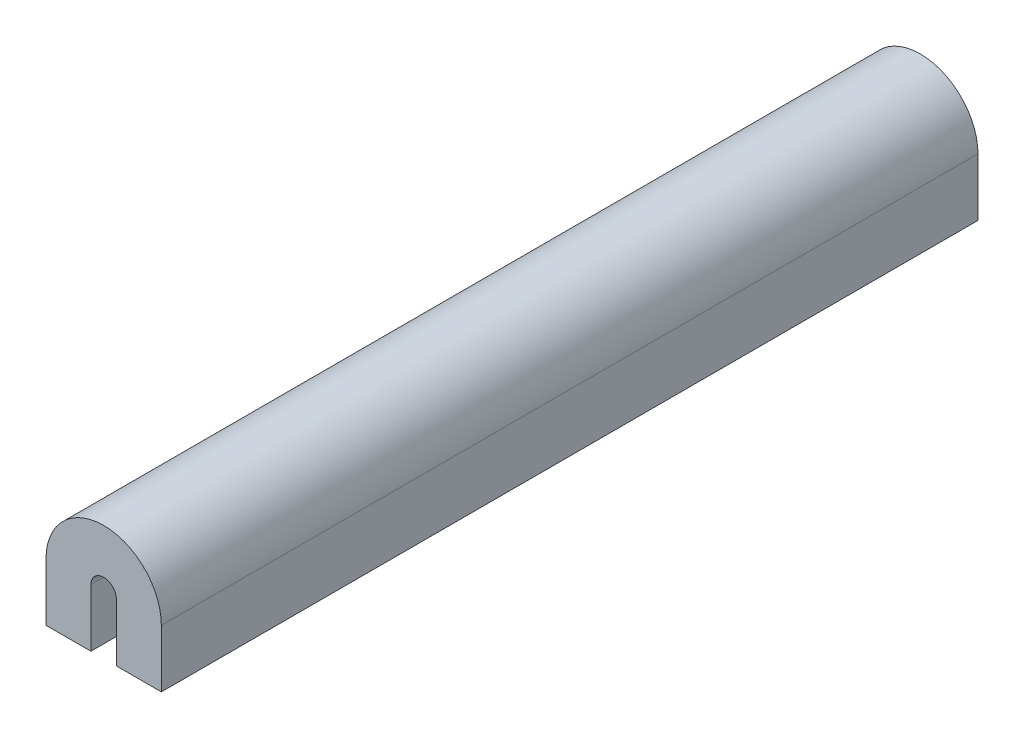
ISO-10303-21;
HEADER;
FILE_DESCRIPTION(('STEP AP214'),'2;1');
FILE_NAME('part.step','',(''),(''),'','','');
FILE_SCHEMA(('AUTOMOTIVE_DESIGN { 1 0 10303 214 1 1 1 1 }'));
ENDSEC;
DATA;
#1=APPLICATION_CONTEXT('core data for automotive mechanical design processes');
#2=APPLICATION_PROTOCOL_DEFINITION('international standard','automotive_design',2000,#1);
#3=PRODUCT_CONTEXT('',#1,'mechanical');
#4=PRODUCT('Part','Part','',(#3));
#5=PRODUCT_RELATED_PRODUCT_CATEGORY('part','',(#4));
#6=PRODUCT_DEFINITION_FORMATION('','',#4);
#7=PRODUCT_DEFINITION_CONTEXT('part definition',#1,'design');
#8=PRODUCT_DEFINITION('design','',#6,#7);
#9=PRODUCT_DEFINITION_SHAPE('','',#8);
#10=(LENGTH_UNIT() NAMED_UNIT(*) SI_UNIT(.MILLI.,.METRE.));
#11=(NAMED_UNIT(*) PLANE_ANGLE_UNIT() SI_UNIT($,.RADIAN.));
#12=(NAMED_UNIT(*) SI_UNIT($,.STERADIAN.) SOLID_ANGLE_UNIT());
#13=UNCERTAINTY_MEASURE_WITH_UNIT(LENGTH_MEASURE(1.E-05),#10,'distance_accuracy_value','');
#14=(GEOMETRIC_REPRESENTATION_CONTEXT(3) GLOBAL_UNCERTAINTY_ASSIGNED_CONTEXT((#13)) GLOBAL_UNIT_ASSIGNED_CONTEXT((#10,
#11,#12)) REPRESENTATION_CONTEXT('',''));
#15=CARTESIAN_POINT('',(0.,0.,0.));
#16=DIRECTION('',(0.,0.,1.));
#17=DIRECTION('',(1.,0.,0.));
#18=AXIS2_PLACEMENT_3D('',#15,#16,#17);
#19=CARTESIAN_POINT('',(0.,0.,101.6));
#20=DIRECTION('',(0.,0.,-1.));
#21=DIRECTION('',(-1.,0.,0.));
#22=AXIS2_PLACEMENT_3D('',#19,#20,#21);
#23=CYLINDRICAL_SURFACE('',#22,1.5875);
#24=CARTESIAN_POINT('',(0.,0.,0.));
#25=DIRECTION('',(0.,0.,-1.));
#26=DIRECTION('',(1.,0.,0.));
#27=AXIS2_PLACEMENT_3D('',#24,#25,#26);
#28=CIRCLE('',#27,1.5875);
#29=CARTESIAN_POINT('',(-1.5875,0.,0.));
#30=VERTEX_POINT('',#29);
#31=CARTESIAN_POINT('',(1.5875,0.,0.));
#32=VERTEX_POINT('',#31);
#33=EDGE_CURVE('E140',#30,#32,#28,.T.);
#34=ORIENTED_EDGE('',*,*,#33,.T.);
#35=DIRECTION('',(0.,0.,-1.));
#36=VECTOR('',#35,1.);
#37=CARTESIAN_POINT('',(1.5875,0.,101.6));
#38=LINE('',#37,#36);
#39=CARTESIAN_POINT('',(1.5875,0.,101.6));
#40=VERTEX_POINT('',#39);
#41=EDGE_CURVE('E11',#40,#32,#38,.T.);
#42=ORIENTED_EDGE('',*,*,#41,.F.);
#43=CARTESIAN_POINT('',(0.,0.,101.6));
#44=DIRECTION('',(0.,0.,-1.));
#45=DIRECTION('',(1.,0.,0.));
#46=AXIS2_PLACEMENT_3D('',#43,#44,#45);
#47=CIRCLE('',#46,1.5875);
#48=CARTESIAN_POINT('',(-1.5875,0.,101.6));
#49=VERTEX_POINT('',#48);
#50=EDGE_CURVE('E162',#49,#40,#47,.T.);
#51=ORIENTED_EDGE('',*,*,#50,.F.);
#52=DIRECTION('',(0.,0.,-1.));
#53=VECTOR('',#52,1.);
#54=CARTESIAN_POINT('',(-1.5875,0.,101.6));
#55=LINE('',#54,#53);
#56=EDGE_CURVE('E136',#49,#30,#55,.T.);
#57=ORIENTED_EDGE('',*,*,#56,.T.);
#58=EDGE_LOOP('',(#34,#42,#51,#57));
#59=FACE_BOUND('',#58,.T.);
#60=ADVANCED_FACE('F39',(#59),#23,.F.);
#61=CARTESIAN_POINT('',(1.5875,0.,101.6));
#62=DIRECTION('',(1.,0.,0.));
#63=DIRECTION('',(0.,0.,-1.));
#64=AXIS2_PLACEMENT_3D('',#61,#62,#63);
#65=PLANE('',#64);
#66=DIRECTION('',(0.,-1.,0.));
#67=VECTOR('',#66,1.);
#68=CARTESIAN_POINT('',(1.5875,0.,0.));
#69=LINE('',#68,#67);
#70=CARTESIAN_POINT('',(1.5875,-7.1755,0.));
#71=VERTEX_POINT('',#70);
#72=EDGE_CURVE('E144',#32,#71,#69,.T.);
#73=ORIENTED_EDGE('',*,*,#72,.T.);
#74=DIRECTION('',(0.,0.,-1.));
#75=VECTOR('',#74,1.);
#76=CARTESIAN_POINT('',(1.5875,-7.1755,101.6));
#77=LINE('',#76,#75);
#78=CARTESIAN_POINT('',(1.5875,-7.1755,101.6));
#79=VERTEX_POINT('',#78);
#80=EDGE_CURVE('E48',#79,#71,#77,.T.);
#81=ORIENTED_EDGE('',*,*,#80,.F.);
#82=DIRECTION('',(0.,-1.,0.));
#83=VECTOR('',#82,1.);
#84=CARTESIAN_POINT('',(1.5875,0.,101.6));
#85=LINE('',#84,#83);
#86=EDGE_CURVE('E99',#40,#79,#85,.T.);
#87=ORIENTED_EDGE('',*,*,#86,.F.);
#88=ORIENTED_EDGE('',*,*,#41,.T.);
#89=EDGE_LOOP('',(#73,#81,#87,#88));
#90=FACE_BOUND('',#89,.T.);
#91=ADVANCED_FACE('F208',(#90),#65,.F.);
#92=CARTESIAN_POINT('',(7.1755,-7.1755,101.6));
#93=DIRECTION('',(0.,1.,0.));
#94=DIRECTION('',(-1.,0.,0.));
#95=AXIS2_PLACEMENT_3D('',#92,#93,#94);
#96=PLANE('',#95);
#97=DIRECTION('',(1.,0.,0.));
#98=VECTOR('',#97,1.);
#99=CARTESIAN_POINT('',(7.1755,-7.1755,0.));
#100=LINE('',#99,#98);
#101=CARTESIAN_POINT('',(7.1755,-7.1755,0.));
#102=VERTEX_POINT('',#101);
#103=EDGE_CURVE('E147',#71,#102,#100,.T.);
#104=ORIENTED_EDGE('',*,*,#103,.T.);
#105=DIRECTION('',(0.,0.,-1.));
#106=VECTOR('',#105,1.);
#107=CARTESIAN_POINT('',(7.1755,-7.1755,101.6));
#108=LINE('',#107,#106);
#109=CARTESIAN_POINT('',(7.1755,-7.1755,101.6));
#110=VERTEX_POINT('',#109);
#111=EDGE_CURVE('E173',#110,#102,#108,.T.);
#112=ORIENTED_EDGE('',*,*,#111,.F.);
#113=DIRECTION('',(1.,0.,0.));
#114=VECTOR('',#113,1.);
#115=CARTESIAN_POINT('',(7.1755,-7.1755,101.6));
#116=LINE('',#115,#114);
#117=EDGE_CURVE('E183',#79,#110,#116,.T.);
#118=ORIENTED_EDGE('',*,*,#117,.F.);
#119=ORIENTED_EDGE('',*,*,#80,.T.);
#120=EDGE_LOOP('',(#104,#112,#118,#119));
#121=FACE_BOUND('',#120,.T.);
#122=ADVANCED_FACE('F181',(#121),#96,.F.);
#123=CARTESIAN_POINT('',(7.1755,0.,101.6));
#124=DIRECTION('',(-1.,0.,0.));
#125=DIRECTION('',(0.,-1.,0.));
#126=AXIS2_PLACEMENT_3D('',#123,#124,#125);
#127=PLANE('',#126);
#128=DIRECTION('',(0.,1.,0.));
#129=VECTOR('',#128,1.);
#130=CARTESIAN_POINT('',(7.1755,0.,0.));
#131=LINE('',#130,#129);
#132=CARTESIAN_POINT('',(7.1755,0.,0.));
#133=VERTEX_POINT('',#132);
#134=EDGE_CURVE('E150',#102,#133,#131,.T.);
#135=ORIENTED_EDGE('',*,*,#134,.T.);
#136=DIRECTION('',(0.,0.,-1.));
#137=VECTOR('',#136,1.);
#138=CARTESIAN_POINT('',(7.1755,0.,101.6));
#139=LINE('',#138,#137);
#140=CARTESIAN_POINT('',(7.1755,0.,101.6));
#141=VERTEX_POINT('',#140);
#142=EDGE_CURVE('E169',#141,#133,#139,.T.);
#143=ORIENTED_EDGE('',*,*,#142,.F.);
#144=DIRECTION('',(0.,1.,0.));
#145=VECTOR('',#144,1.);
#146=CARTESIAN_POINT('',(7.1755,0.,101.6));
#147=LINE('',#146,#145);
#148=EDGE_CURVE('E196',#110,#141,#147,.T.);
#149=ORIENTED_EDGE('',*,*,#148,.F.);
#150=ORIENTED_EDGE('',*,*,#111,.T.);
#151=EDGE_LOOP('',(#135,#143,#149,#150));
#152=FACE_BOUND('',#151,.T.);
#153=ADVANCED_FACE('F191',(#152),#127,.F.);
#154=CARTESIAN_POINT('',(0.,0.,101.6));
#155=DIRECTION('',(0.,0.,-1.));
#156=DIRECTION('',(-1.,0.,0.));
#157=AXIS2_PLACEMENT_3D('',#154,#155,#156);
#158=CYLINDRICAL_SURFACE('',#157,7.1755);
#159=CARTESIAN_POINT('',(0.,0.,0.));
#160=DIRECTION('',(0.,0.,1.));
#161=DIRECTION('',(1.,0.,0.));
#162=AXIS2_PLACEMENT_3D('',#159,#160,#161);
#163=CIRCLE('',#162,7.1755);
#164=CARTESIAN_POINT('',(-7.1755,0.,0.));
#165=VERTEX_POINT('',#164);
#166=EDGE_CURVE('E153',#133,#165,#163,.T.);
#167=ORIENTED_EDGE('',*,*,#166,.T.);
#168=DIRECTION('',(0.,0.,-1.));
#169=VECTOR('',#168,1.);
#170=CARTESIAN_POINT('',(-7.1755,0.,101.6));
#171=LINE('',#170,#169);
#172=CARTESIAN_POINT('',(-7.1755,0.,101.6));
#173=VERTEX_POINT('',#172);
#174=EDGE_CURVE('E129',#173,#165,#171,.T.);
#175=ORIENTED_EDGE('',*,*,#174,.F.);
#176=CARTESIAN_POINT('',(0.,0.,101.6));
#177=DIRECTION('',(0.,0.,1.));
#178=DIRECTION('',(1.,0.,0.));
#179=AXIS2_PLACEMENT_3D('',#176,#177,#178);
#180=CIRCLE('',#179,7.1755);
#181=EDGE_CURVE('E118',#141,#173,#180,.T.);
#182=ORIENTED_EDGE('',*,*,#181,.F.);
#183=ORIENTED_EDGE('',*,*,#142,.T.);
#184=EDGE_LOOP('',(#167,#175,#182,#183));
#185=FACE_BOUND('',#184,.T.);
#186=ADVANCED_FACE('F194',(#185),#158,.T.);
#187=CARTESIAN_POINT('',(-7.1755,0.,101.6));
#188=DIRECTION('',(1.,0.,0.));
#189=DIRECTION('',(0.,1.,0.));
#190=AXIS2_PLACEMENT_3D('',#187,#188,#189);
#191=PLANE('',#190);
#192=DIRECTION('',(0.,-1.,0.));
#193=VECTOR('',#192,1.);
#194=CARTESIAN_POINT('',(-7.1755,0.,0.));
#195=LINE('',#194,#193);
#196=CARTESIAN_POINT('',(-7.1755,-7.1755,0.));
#197=VERTEX_POINT('',#196);
#198=EDGE_CURVE('E127',#165,#197,#195,.T.);
#199=ORIENTED_EDGE('',*,*,#198,.T.);
#200=DIRECTION('',(0.,0.,-1.));
#201=VECTOR('',#200,1.);
#202=CARTESIAN_POINT('',(-7.1755,-7.1755,101.6));
#203=LINE('',#202,#201);
#204=CARTESIAN_POINT('',(-7.1755,-7.1755,101.6));
#205=VERTEX_POINT('',#204);
#206=EDGE_CURVE('E124',#205,#197,#203,.T.);
#207=ORIENTED_EDGE('',*,*,#206,.F.);
#208=DIRECTION('',(0.,-1.,0.));
#209=VECTOR('',#208,1.);
#210=CARTESIAN_POINT('',(-7.1755,0.,101.6));
#211=LINE('',#210,#209);
#212=EDGE_CURVE('E112',#173,#205,#211,.T.);
#213=ORIENTED_EDGE('',*,*,#212,.F.);
#214=ORIENTED_EDGE('',*,*,#174,.T.);
#215=EDGE_LOOP('',(#199,#207,#213,#214));
#216=FACE_BOUND('',#215,.T.);
#217=ADVANCED_FACE('F125',(#216),#191,.F.);
#218=CARTESIAN_POINT('',(-7.1755,-7.1755,101.6));
#219=DIRECTION('',(0.,1.,0.));
#220=DIRECTION('',(-1.,0.,0.));
#221=AXIS2_PLACEMENT_3D('',#218,#219,#220);
#222=PLANE('',#221);
#223=DIRECTION('',(1.,0.,0.));
#224=VECTOR('',#223,1.);
#225=CARTESIAN_POINT('',(-7.1755,-7.1755,0.));
#226=LINE('',#225,#224);
#227=CARTESIAN_POINT('',(-1.5875,-7.1755,0.));
#228=VERTEX_POINT('',#227);
#229=EDGE_CURVE('E85',#197,#228,#226,.T.);
#230=ORIENTED_EDGE('',*,*,#229,.T.);
#231=DIRECTION('',(0.,0.,-1.));
#232=VECTOR('',#231,1.);
#233=CARTESIAN_POINT('',(-1.5875,-7.1755,101.6));
#234=LINE('',#233,#232);
#235=CARTESIAN_POINT('',(-1.5875,-7.1755,101.6));
#236=VERTEX_POINT('',#235);
#237=EDGE_CURVE('E130',#236,#228,#234,.T.);
#238=ORIENTED_EDGE('',*,*,#237,.F.);
#239=DIRECTION('',(1.,0.,0.));
#240=VECTOR('',#239,1.);
#241=CARTESIAN_POINT('',(-7.1755,-7.1755,101.6));
#242=LINE('',#241,#240);
#243=EDGE_CURVE('E116',#205,#236,#242,.T.);
#244=ORIENTED_EDGE('',*,*,#243,.F.);
#245=ORIENTED_EDGE('',*,*,#206,.T.);
#246=EDGE_LOOP('',(#230,#238,#244,#245));
#247=FACE_BOUND('',#246,.T.);
#248=ADVANCED_FACE('F132',(#247),#222,.F.);
#249=CARTESIAN_POINT('',(-1.5875,0.,101.6));
#250=DIRECTION('',(-1.,0.,0.));
#251=DIRECTION('',(0.,0.,1.));
#252=AXIS2_PLACEMENT_3D('',#249,#250,#251);
#253=PLANE('',#252);
#254=DIRECTION('',(0.,1.,0.));
#255=VECTOR('',#254,1.);
#256=CARTESIAN_POINT('',(-1.5875,0.,0.));
#257=LINE('',#256,#255);
#258=EDGE_CURVE('E91',#228,#30,#257,.T.);
#259=ORIENTED_EDGE('',*,*,#258,.T.);
#260=ORIENTED_EDGE('',*,*,#56,.F.);
#261=DIRECTION('',(0.,1.,0.));
#262=VECTOR('',#261,1.);
#263=CARTESIAN_POINT('',(-1.5875,0.,101.6));
#264=LINE('',#263,#262);
#265=EDGE_CURVE('E56',#236,#49,#264,.T.);
#266=ORIENTED_EDGE('',*,*,#265,.F.);
#267=ORIENTED_EDGE('',*,*,#237,.T.);
#268=EDGE_LOOP('',(#259,#260,#266,#267));
#269=FACE_BOUND('',#268,.T.);
#270=ADVANCED_FACE('F224',(#269),#253,.F.);
#271=CARTESIAN_POINT('',(0.,0.,101.6));
#272=DIRECTION('',(0.,0.,1.));
#273=DIRECTION('',(1.,0.,0.));
#274=AXIS2_PLACEMENT_3D('',#271,#272,#273);
#275=PLANE('',#274);
#276=ORIENTED_EDGE('',*,*,#50,.T.);
#277=ORIENTED_EDGE('',*,*,#86,.T.);
#278=ORIENTED_EDGE('',*,*,#117,.T.);
#279=ORIENTED_EDGE('',*,*,#148,.T.);
#280=ORIENTED_EDGE('',*,*,#181,.T.);
#281=ORIENTED_EDGE('',*,*,#212,.T.);
#282=ORIENTED_EDGE('',*,*,#243,.T.);
#283=ORIENTED_EDGE('',*,*,#265,.T.);
#284=EDGE_LOOP('',(#276,#277,#278,#279,#280,#281,#282,#283));
#285=FACE_BOUND('',#284,.T.);
#286=ADVANCED_FACE('F114',(#285),#275,.T.);
#287=CARTESIAN_POINT('',(0.,0.,0.));
#288=DIRECTION('',(0.,0.,1.));
#289=DIRECTION('',(1.,0.,0.));
#290=AXIS2_PLACEMENT_3D('',#287,#288,#289);
#291=PLANE('',#290);
#292=ORIENTED_EDGE('',*,*,#33,.F.);
#293=ORIENTED_EDGE('',*,*,#258,.F.);
#294=ORIENTED_EDGE('',*,*,#229,.F.);
#295=ORIENTED_EDGE('',*,*,#198,.F.);
#296=ORIENTED_EDGE('',*,*,#166,.F.);
#297=ORIENTED_EDGE('',*,*,#134,.F.);
#298=ORIENTED_EDGE('',*,*,#103,.F.);
#299=ORIENTED_EDGE('',*,*,#72,.F.);
#300=EDGE_LOOP('',(#292,#293,#294,#295,#296,#297,#298,#299));
#301=FACE_BOUND('',#300,.T.);
#302=ADVANCED_FACE('F187',(#301),#291,.F.);
#303=CLOSED_SHELL('',(#60,#91,#122,#153,#186,#217,#248,#270,#286,#302));
#304=MANIFOLD_SOLID_BREP('B2',#303);
#305=ADVANCED_BREP_SHAPE_REPRESENTATION('',(#18,#304),#14);
#306=SHAPE_DEFINITION_REPRESENTATION(#9,#305);
ENDSEC;
END-ISO-10303-21;
